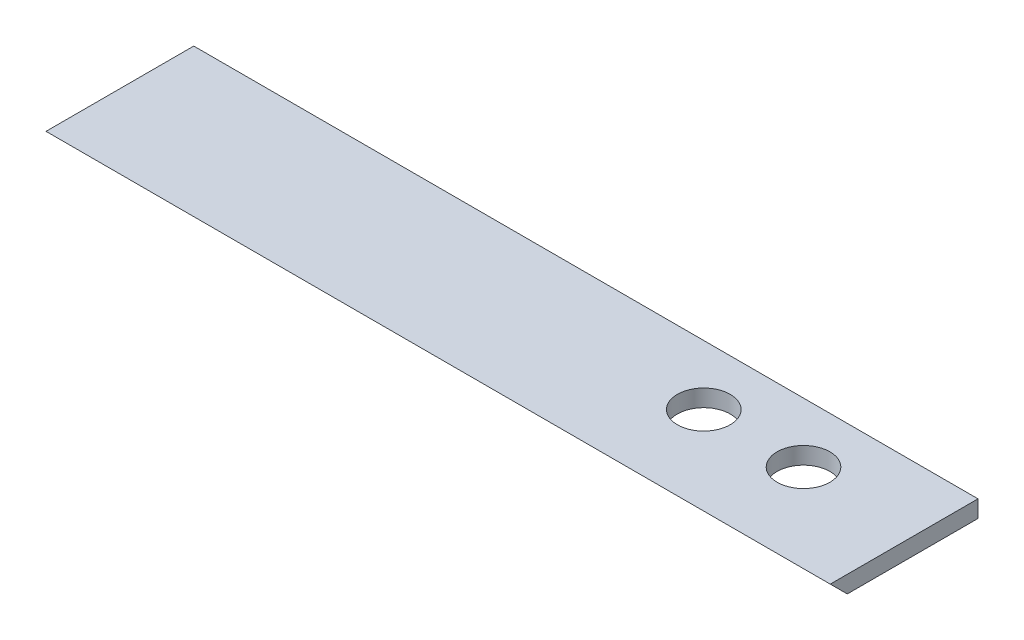
ISO-10303-21;
HEADER;
FILE_DESCRIPTION(('STEP AP214'),'2;1');
FILE_NAME('part.step','',(''),(''),'','','');
FILE_SCHEMA(('AUTOMOTIVE_DESIGN { 1 0 10303 214 1 1 1 1 }'));
ENDSEC;
DATA;
#1=APPLICATION_CONTEXT('core data for automotive mechanical design processes');
#2=APPLICATION_PROTOCOL_DEFINITION('international standard','automotive_design',2000,#1);
#3=PRODUCT_CONTEXT('',#1,'mechanical');
#4=PRODUCT('Part','Part','',(#3));
#5=PRODUCT_RELATED_PRODUCT_CATEGORY('part','',(#4));
#6=PRODUCT_DEFINITION_FORMATION('','',#4);
#7=PRODUCT_DEFINITION_CONTEXT('part definition',#1,'design');
#8=PRODUCT_DEFINITION('design','',#6,#7);
#9=PRODUCT_DEFINITION_SHAPE('','',#8);
#10=(LENGTH_UNIT() NAMED_UNIT(*) SI_UNIT(.MILLI.,.METRE.));
#11=(NAMED_UNIT(*) PLANE_ANGLE_UNIT() SI_UNIT($,.RADIAN.));
#12=(NAMED_UNIT(*) SI_UNIT($,.STERADIAN.) SOLID_ANGLE_UNIT());
#13=UNCERTAINTY_MEASURE_WITH_UNIT(LENGTH_MEASURE(1.E-05),#10,'distance_accuracy_value','');
#14=(GEOMETRIC_REPRESENTATION_CONTEXT(3) GLOBAL_UNCERTAINTY_ASSIGNED_CONTEXT((#13)) GLOBAL_UNIT_ASSIGNED_CONTEXT((#10,
#11,#12)) REPRESENTATION_CONTEXT('',''));
#15=CARTESIAN_POINT('',(0.,0.,0.));
#16=DIRECTION('',(0.,0.,1.));
#17=DIRECTION('',(1.,0.,0.));
#18=AXIS2_PLACEMENT_3D('',#15,#16,#17);
#19=CARTESIAN_POINT('',(813.499456959929,19.05,-149.281818106448));
#20=DIRECTION('',(1.,0.,0.));
#21=DIRECTION('',(0.,0.,-1.));
#22=AXIS2_PLACEMENT_3D('',#19,#20,#21);
#23=PLANE('',#22);
#24=DIRECTION('',(0.,0.707106781186551,0.707106781186544));
#25=VECTOR('',#24,1.);
#26=CARTESIAN_POINT('',(813.499456959929,-63.5,-66.7318181064474));
#27=LINE('',#26,#25);
#28=CARTESIAN_POINT('',(813.499456959929,0.,-3.23181810644817));
#29=VERTEX_POINT('',#28);
#30=CARTESIAN_POINT('',(813.499456959929,19.05,15.8181818935516));
#31=VERTEX_POINT('',#30);
#32=EDGE_CURVE('E107',#29,#31,#27,.T.);
#33=ORIENTED_EDGE('',*,*,#32,.F.);
#34=DIRECTION('',(0.,0.,1.));
#35=VECTOR('',#34,1.);
#36=CARTESIAN_POINT('',(813.499456959929,0.,-149.281818106448));
#37=LINE('',#36,#35);
#38=CARTESIAN_POINT('',(813.499456959929,0.,-149.281818106448));
#39=VERTEX_POINT('',#38);
#40=EDGE_CURVE('E85',#39,#29,#37,.T.);
#41=ORIENTED_EDGE('',*,*,#40,.F.);
#42=DIRECTION('',(0.,-1.,0.));
#43=VECTOR('',#42,1.);
#44=CARTESIAN_POINT('',(813.499456959929,19.05,-149.281818106448));
#45=LINE('',#44,#43);
#46=CARTESIAN_POINT('',(813.499456959929,19.05,-149.281818106448));
#47=VERTEX_POINT('',#46);
#48=EDGE_CURVE('E41',#47,#39,#45,.T.);
#49=ORIENTED_EDGE('',*,*,#48,.F.);
#50=DIRECTION('',(0.,0.,1.));
#51=VECTOR('',#50,1.);
#52=CARTESIAN_POINT('',(813.499456959929,19.05,-149.281818106448));
#53=LINE('',#52,#51);
#54=EDGE_CURVE('E93',#47,#31,#53,.T.);
#55=ORIENTED_EDGE('',*,*,#54,.T.);
#56=EDGE_LOOP('',(#33,#41,#49,#55));
#57=FACE_BOUND('',#56,.T.);
#58=ADVANCED_FACE('F34',(#57),#23,.T.);
#59=CARTESIAN_POINT('',(-62.800543040071,19.05,-149.281818106448));
#60=DIRECTION('',(0.,0.,-1.));
#61=DIRECTION('',(-1.,0.,0.));
#62=AXIS2_PLACEMENT_3D('',#59,#60,#61);
#63=PLANE('',#62);
#64=DIRECTION('',(1.,0.,0.));
#65=VECTOR('',#64,1.);
#66=CARTESIAN_POINT('',(-62.800543040071,0.,-149.281818106448));
#67=LINE('',#66,#65);
#68=CARTESIAN_POINT('',(-62.800543040071,0.,-149.281818106448));
#69=VERTEX_POINT('',#68);
#70=EDGE_CURVE('E80',#69,#39,#67,.T.);
#71=ORIENTED_EDGE('',*,*,#70,.F.);
#72=DIRECTION('',(0.,-1.,0.));
#73=VECTOR('',#72,1.);
#74=CARTESIAN_POINT('',(-62.800543040071,19.05,-149.281818106448));
#75=LINE('',#74,#73);
#76=CARTESIAN_POINT('',(-62.800543040071,19.05,-149.281818106448));
#77=VERTEX_POINT('',#76);
#78=EDGE_CURVE('E56',#77,#69,#75,.T.);
#79=ORIENTED_EDGE('',*,*,#78,.F.);
#80=DIRECTION('',(1.,0.,0.));
#81=VECTOR('',#80,1.);
#82=CARTESIAN_POINT('',(-62.800543040071,19.05,-149.281818106448));
#83=LINE('',#82,#81);
#84=EDGE_CURVE('E91',#77,#47,#83,.T.);
#85=ORIENTED_EDGE('',*,*,#84,.T.);
#86=ORIENTED_EDGE('',*,*,#48,.T.);
#87=EDGE_LOOP('',(#71,#79,#85,#86));
#88=FACE_BOUND('',#87,.T.);
#89=ADVANCED_FACE('F83',(#88),#63,.T.);
#90=CARTESIAN_POINT('',(-62.800543040071,19.05,-149.281818106448));
#91=DIRECTION('',(1.,0.,0.));
#92=DIRECTION('',(0.,0.,-1.));
#93=AXIS2_PLACEMENT_3D('',#90,#91,#92);
#94=PLANE('',#93);
#95=DIRECTION('',(0.,0.,1.));
#96=VECTOR('',#95,1.);
#97=CARTESIAN_POINT('',(-62.800543040071,0.,-149.281818106448));
#98=LINE('',#97,#96);
#99=CARTESIAN_POINT('',(-62.800543040071,0.,-3.2318181064481));
#100=VERTEX_POINT('',#99);
#101=EDGE_CURVE('E70',#69,#100,#98,.T.);
#102=ORIENTED_EDGE('',*,*,#101,.T.);
#103=DIRECTION('',(0.,-0.707106781186551,-0.707106781186544));
#104=VECTOR('',#103,1.);
#105=CARTESIAN_POINT('',(-62.800543040071,0.,-3.23181810644809));
#106=LINE('',#105,#104);
#107=CARTESIAN_POINT('',(-62.800543040071,19.05,15.8181818935517));
#108=VERTEX_POINT('',#107);
#109=EDGE_CURVE('E47',#108,#100,#106,.T.);
#110=ORIENTED_EDGE('',*,*,#109,.F.);
#111=DIRECTION('',(0.,0.,1.));
#112=VECTOR('',#111,1.);
#113=CARTESIAN_POINT('',(-62.800543040071,19.05,-149.281818106448));
#114=LINE('',#113,#112);
#115=EDGE_CURVE('E72',#77,#108,#114,.T.);
#116=ORIENTED_EDGE('',*,*,#115,.F.);
#117=ORIENTED_EDGE('',*,*,#78,.T.);
#118=EDGE_LOOP('',(#102,#110,#116,#117));
#119=FACE_BOUND('',#118,.T.);
#120=ADVANCED_FACE('F69',(#119),#94,.F.);
#121=CARTESIAN_POINT('',(0.,19.05,0.));
#122=DIRECTION('',(0.,-1.,0.));
#123=DIRECTION('',(0.,0.,-1.));
#124=AXIS2_PLACEMENT_3D('',#121,#122,#123);
#125=PLANE('',#124);
#126=CARTESIAN_POINT('',(685.24027425031,19.05,-82.5679467617447));
#127=DIRECTION('',(0.,1.,0.));
#128=DIRECTION('',(0.,0.,1.));
#129=AXIS2_PLACEMENT_3D('',#126,#127,#128);
#130=CIRCLE('',#129,29.499999928);
#131=CARTESIAN_POINT('',(685.24027425031,19.05,-53.0679468337446));
#132=VERTEX_POINT('',#131);
#133=EDGE_CURVE('E104',#132,#132,#130,.T.);
#134=ORIENTED_EDGE('',*,*,#133,.F.);
#135=EDGE_LOOP('',(#134));
#136=FACE_BOUND('',#135,.T.);
#137=CARTESIAN_POINT('',(573.905935057533,19.05,-82.4588113000032));
#138=DIRECTION('',(0.,1.,0.));
#139=DIRECTION('',(0.,0.,1.));
#140=AXIS2_PLACEMENT_3D('',#137,#138,#139);
#141=CIRCLE('',#140,29.4999999279999);
#142=CARTESIAN_POINT('',(573.905935057533,19.05,-52.9588113720032));
#143=VERTEX_POINT('',#142);
#144=EDGE_CURVE('E98',#143,#143,#141,.T.);
#145=ORIENTED_EDGE('',*,*,#144,.F.);
#146=EDGE_LOOP('',(#145));
#147=FACE_BOUND('',#146,.T.);
#148=DIRECTION('',(1.,0.,0.));
#149=VECTOR('',#148,1.);
#150=CARTESIAN_POINT('',(-62.800543040071,19.05,15.8181818935517));
#151=LINE('',#150,#149);
#152=EDGE_CURVE('E81',#108,#31,#151,.T.);
#153=ORIENTED_EDGE('',*,*,#152,.T.);
#154=ORIENTED_EDGE('',*,*,#54,.F.);
#155=ORIENTED_EDGE('',*,*,#84,.F.);
#156=ORIENTED_EDGE('',*,*,#115,.T.);
#157=EDGE_LOOP('',(#153,#154,#155,#156));
#158=FACE_BOUND('',#157,.T.);
#159=ADVANCED_FACE('F120',(#136,#147,#158),#125,.F.);
#160=CARTESIAN_POINT('',(0.,0.,0.));
#161=DIRECTION('',(0.,-1.,0.));
#162=DIRECTION('',(0.,0.,-1.));
#163=AXIS2_PLACEMENT_3D('',#160,#161,#162);
#164=PLANE('',#163);
#165=DIRECTION('',(1.,0.,0.));
#166=VECTOR('',#165,1.);
#167=CARTESIAN_POINT('',(0.,0.,-3.2318181064481));
#168=LINE('',#167,#166);
#169=EDGE_CURVE('E11',#100,#29,#168,.T.);
#170=ORIENTED_EDGE('',*,*,#169,.F.);
#171=ORIENTED_EDGE('',*,*,#101,.F.);
#172=ORIENTED_EDGE('',*,*,#70,.T.);
#173=ORIENTED_EDGE('',*,*,#40,.T.);
#174=EDGE_LOOP('',(#170,#171,#172,#173));
#175=FACE_BOUND('',#174,.T.);
#176=CARTESIAN_POINT('',(685.24027425031,0.,-82.5679467617447));
#177=DIRECTION('',(0.,1.,0.));
#178=DIRECTION('',(0.,0.,1.));
#179=AXIS2_PLACEMENT_3D('',#176,#177,#178);
#180=CIRCLE('',#179,29.499999928);
#181=CARTESIAN_POINT('',(685.24027425031,0.,-53.0679468337446));
#182=VERTEX_POINT('',#181);
#183=EDGE_CURVE('E101',#182,#182,#180,.T.);
#184=ORIENTED_EDGE('',*,*,#183,.T.);
#185=EDGE_LOOP('',(#184));
#186=FACE_BOUND('',#185,.T.);
#187=CARTESIAN_POINT('',(573.905935057533,0.,-82.4588113000032));
#188=DIRECTION('',(0.,1.,0.));
#189=DIRECTION('',(0.,0.,1.));
#190=AXIS2_PLACEMENT_3D('',#187,#188,#189);
#191=CIRCLE('',#190,29.4999999279999);
#192=CARTESIAN_POINT('',(573.905935057533,0.,-52.9588113720032));
#193=VERTEX_POINT('',#192);
#194=EDGE_CURVE('E87',#193,#193,#191,.T.);
#195=ORIENTED_EDGE('',*,*,#194,.T.);
#196=EDGE_LOOP('',(#195));
#197=FACE_BOUND('',#196,.T.);
#198=ADVANCED_FACE('F77',(#175,#186,#197),#164,.T.);
#199=CARTESIAN_POINT('',(573.905935057533,0.,-82.4588113000032));
#200=DIRECTION('',(0.,1.,0.));
#201=DIRECTION('',(0.,0.,1.));
#202=AXIS2_PLACEMENT_3D('',#199,#200,#201);
#203=CYLINDRICAL_SURFACE('',#202,29.4999999279999);
#204=CARTESIAN_POINT('',(573.905935057533,0.,-52.9588113720032));
#205=CARTESIAN_POINT('',(573.905935057533,0.1984375,-52.9588113720032));
#206=CARTESIAN_POINT('',(573.905935057533,0.396875,-52.9588113720032));
#207=CARTESIAN_POINT('',(573.905935057533,0.79375,-52.9588113720032));
#208=CARTESIAN_POINT('',(573.905935057533,0.9921875,-52.9588113720032));
#209=CARTESIAN_POINT('',(573.905935057533,1.3890625,-52.9588113720032));
#210=CARTESIAN_POINT('',(573.905935057533,1.5875,-52.9588113720032));
#211=CARTESIAN_POINT('',(573.905935057533,1.984375,-52.9588113720032));
#212=CARTESIAN_POINT('',(573.905935057533,2.1828125,-52.9588113720032));
#213=CARTESIAN_POINT('',(573.905935057533,2.5796875,-52.9588113720032));
#214=CARTESIAN_POINT('',(573.905935057533,2.778125,-52.9588113720032));
#215=CARTESIAN_POINT('',(573.905935057533,3.175,-52.9588113720032));
#216=CARTESIAN_POINT('',(573.905935057533,3.3734375,-52.9588113720032));
#217=CARTESIAN_POINT('',(573.905935057533,3.7703125,-52.9588113720032));
#218=CARTESIAN_POINT('',(573.905935057533,3.96875,-52.9588113720032));
#219=CARTESIAN_POINT('',(573.905935057533,4.365625,-52.9588113720032));
#220=CARTESIAN_POINT('',(573.905935057533,4.5640625,-52.9588113720032));
#221=CARTESIAN_POINT('',(573.905935057533,4.9609375,-52.9588113720032));
#222=CARTESIAN_POINT('',(573.905935057533,5.159375,-52.9588113720032));
#223=CARTESIAN_POINT('',(573.905935057533,5.55625,-52.9588113720032));
#224=CARTESIAN_POINT('',(573.905935057533,5.7546875,-52.9588113720032));
#225=CARTESIAN_POINT('',(573.905935057533,6.1515625,-52.9588113720032));
#226=CARTESIAN_POINT('',(573.905935057533,6.35,-52.9588113720032));
#227=CARTESIAN_POINT('',(573.905935057533,6.746875,-52.9588113720032));
#228=CARTESIAN_POINT('',(573.905935057533,6.9453125,-52.9588113720032));
#229=CARTESIAN_POINT('',(573.905935057533,7.3421875,-52.9588113720032));
#230=CARTESIAN_POINT('',(573.905935057533,7.540625,-52.9588113720032));
#231=CARTESIAN_POINT('',(573.905935057533,7.9375,-52.9588113720032));
#232=CARTESIAN_POINT('',(573.905935057533,8.1359375,-52.9588113720032));
#233=CARTESIAN_POINT('',(573.905935057533,8.5328125,-52.9588113720032));
#234=CARTESIAN_POINT('',(573.905935057533,8.73125,-52.9588113720032));
#235=CARTESIAN_POINT('',(573.905935057533,9.128125,-52.9588113720032));
#236=CARTESIAN_POINT('',(573.905935057533,9.3265625,-52.9588113720032));
#237=CARTESIAN_POINT('',(573.905935057533,9.7234375,-52.9588113720032));
#238=CARTESIAN_POINT('',(573.905935057533,9.921875,-52.9588113720032));
#239=CARTESIAN_POINT('',(573.905935057533,10.31875,-52.9588113720032));
#240=CARTESIAN_POINT('',(573.905935057533,10.5171875,-52.9588113720032));
#241=CARTESIAN_POINT('',(573.905935057533,10.9140625,-52.9588113720032));
#242=CARTESIAN_POINT('',(573.905935057533,11.1125,-52.9588113720032));
#243=CARTESIAN_POINT('',(573.905935057533,11.509375,-52.9588113720032));
#244=CARTESIAN_POINT('',(573.905935057533,11.7078125,-52.9588113720032));
#245=CARTESIAN_POINT('',(573.905935057533,12.1046875,-52.9588113720032));
#246=CARTESIAN_POINT('',(573.905935057533,12.303125,-52.9588113720032));
#247=CARTESIAN_POINT('',(573.905935057533,12.7,-52.9588113720032));
#248=CARTESIAN_POINT('',(573.905935057533,12.8984375,-52.9588113720032));
#249=CARTESIAN_POINT('',(573.905935057533,13.2953125,-52.9588113720032));
#250=CARTESIAN_POINT('',(573.905935057533,13.49375,-52.9588113720032));
#251=CARTESIAN_POINT('',(573.905935057533,13.890625,-52.9588113720032));
#252=CARTESIAN_POINT('',(573.905935057533,14.0890625,-52.9588113720032));
#253=CARTESIAN_POINT('',(573.905935057533,14.4859375,-52.9588113720032));
#254=CARTESIAN_POINT('',(573.905935057533,14.684375,-52.9588113720032));
#255=CARTESIAN_POINT('',(573.905935057533,15.08125,-52.9588113720032));
#256=CARTESIAN_POINT('',(573.905935057533,15.2796875,-52.9588113720032));
#257=CARTESIAN_POINT('',(573.905935057533,15.6765625,-52.9588113720032));
#258=CARTESIAN_POINT('',(573.905935057533,15.875,-52.9588113720032));
#259=CARTESIAN_POINT('',(573.905935057533,16.271875,-52.9588113720032));
#260=CARTESIAN_POINT('',(573.905935057533,16.4703125,-52.9588113720032));
#261=CARTESIAN_POINT('',(573.905935057533,16.8671875,-52.9588113720032));
#262=CARTESIAN_POINT('',(573.905935057533,17.065625,-52.9588113720032));
#263=CARTESIAN_POINT('',(573.905935057533,17.4625,-52.9588113720032));
#264=CARTESIAN_POINT('',(573.905935057533,17.6609375,-52.9588113720032));
#265=CARTESIAN_POINT('',(573.905935057533,18.0578125,-52.9588113720032));
#266=CARTESIAN_POINT('',(573.905935057533,18.25625,-52.9588113720032));
#267=CARTESIAN_POINT('',(573.905935057533,18.653125,-52.9588113720032));
#268=CARTESIAN_POINT('',(573.905935057533,18.8515625,-52.9588113720032));
#269=CARTESIAN_POINT('',(573.905935057533,19.05,-52.9588113720032));
#270=B_SPLINE_CURVE_WITH_KNOTS('',3,(#204,#205,#206,#207,#208,#209,#210,#211,#212,#213,#214,
#215,#216,#217,#218,#219,#220,#221,#222,#223,#224,#225,#226,#227,#228,#229,#230,#231,#232,#233,
#234,#235,#236,#237,#238,#239,#240,#241,#242,#243,#244,#245,#246,#247,#248,#249,#250,#251,#252,
#253,#254,#255,#256,#257,#258,#259,#260,#261,#262,#263,#264,#265,#266,#267,#268,#269),
.UNSPECIFIED.,.F.,.F.,(4,2,2,2,2,2,2,2,2,2,2,2,2,2,2,2,2,2,2,2,2,2,2,2,2,2,2,2,2,2,2,2,4),(0.,
0.5953125,1.190625,1.7859375,2.38125,2.9765625,3.571875,4.1671875,4.7625,5.3578125,5.953125,
6.5484375,7.14375,7.7390625,8.334375,8.9296875,9.525,10.1203125,10.715625,11.3109375,11.90625,
12.5015625,13.096875,13.6921875,14.2875,14.8828125,15.478125,16.0734375,16.66875,17.2640625,
17.859375,18.4546875,19.05),.UNSPECIFIED.);
#271=EDGE_CURVE('BSEAM133',#193,#143,#270,.T.);
#272=ORIENTED_EDGE('',*,*,#194,.F.);
#273=ORIENTED_EDGE('',*,*,#144,.T.);
#274=ORIENTED_EDGE('',*,*,#271,.T.);
#275=ORIENTED_EDGE('',*,*,#271,.F.);
#276=EDGE_LOOP('',(#272,#274,#273,#275));
#277=FACE_BOUND('',#276,.T.);
#278=ADVANCED_FACE('F133',(#277),#203,.F.);
#279=CARTESIAN_POINT('',(685.24027425031,0.,-82.5679467617447));
#280=DIRECTION('',(0.,1.,0.));
#281=DIRECTION('',(0.,0.,1.));
#282=AXIS2_PLACEMENT_3D('',#279,#280,#281);
#283=CYLINDRICAL_SURFACE('',#282,29.499999928);
#284=CARTESIAN_POINT('',(685.24027425031,0.,-53.0679468337446));
#285=CARTESIAN_POINT('',(685.24027425031,0.1984375,-53.0679468337446));
#286=CARTESIAN_POINT('',(685.24027425031,0.396875,-53.0679468337446));
#287=CARTESIAN_POINT('',(685.24027425031,0.79375,-53.0679468337446));
#288=CARTESIAN_POINT('',(685.24027425031,0.9921875,-53.0679468337446));
#289=CARTESIAN_POINT('',(685.24027425031,1.3890625,-53.0679468337446));
#290=CARTESIAN_POINT('',(685.24027425031,1.5875,-53.0679468337446));
#291=CARTESIAN_POINT('',(685.24027425031,1.984375,-53.0679468337446));
#292=CARTESIAN_POINT('',(685.24027425031,2.1828125,-53.0679468337446));
#293=CARTESIAN_POINT('',(685.24027425031,2.5796875,-53.0679468337446));
#294=CARTESIAN_POINT('',(685.24027425031,2.778125,-53.0679468337446));
#295=CARTESIAN_POINT('',(685.24027425031,3.175,-53.0679468337446));
#296=CARTESIAN_POINT('',(685.24027425031,3.3734375,-53.0679468337446));
#297=CARTESIAN_POINT('',(685.24027425031,3.7703125,-53.0679468337446));
#298=CARTESIAN_POINT('',(685.24027425031,3.96875,-53.0679468337446));
#299=CARTESIAN_POINT('',(685.24027425031,4.365625,-53.0679468337446));
#300=CARTESIAN_POINT('',(685.24027425031,4.5640625,-53.0679468337446));
#301=CARTESIAN_POINT('',(685.24027425031,4.9609375,-53.0679468337446));
#302=CARTESIAN_POINT('',(685.24027425031,5.159375,-53.0679468337446));
#303=CARTESIAN_POINT('',(685.24027425031,5.55625,-53.0679468337446));
#304=CARTESIAN_POINT('',(685.24027425031,5.7546875,-53.0679468337446));
#305=CARTESIAN_POINT('',(685.24027425031,6.1515625,-53.0679468337446));
#306=CARTESIAN_POINT('',(685.24027425031,6.35,-53.0679468337446));
#307=CARTESIAN_POINT('',(685.24027425031,6.746875,-53.0679468337446));
#308=CARTESIAN_POINT('',(685.24027425031,6.9453125,-53.0679468337446));
#309=CARTESIAN_POINT('',(685.24027425031,7.3421875,-53.0679468337446));
#310=CARTESIAN_POINT('',(685.24027425031,7.540625,-53.0679468337446));
#311=CARTESIAN_POINT('',(685.24027425031,7.9375,-53.0679468337446));
#312=CARTESIAN_POINT('',(685.24027425031,8.1359375,-53.0679468337446));
#313=CARTESIAN_POINT('',(685.24027425031,8.5328125,-53.0679468337446));
#314=CARTESIAN_POINT('',(685.24027425031,8.73125,-53.0679468337446));
#315=CARTESIAN_POINT('',(685.24027425031,9.128125,-53.0679468337446));
#316=CARTESIAN_POINT('',(685.24027425031,9.3265625,-53.0679468337446));
#317=CARTESIAN_POINT('',(685.24027425031,9.7234375,-53.0679468337446));
#318=CARTESIAN_POINT('',(685.24027425031,9.921875,-53.0679468337446));
#319=CARTESIAN_POINT('',(685.24027425031,10.31875,-53.0679468337446));
#320=CARTESIAN_POINT('',(685.24027425031,10.5171875,-53.0679468337446));
#321=CARTESIAN_POINT('',(685.24027425031,10.9140625,-53.0679468337446));
#322=CARTESIAN_POINT('',(685.24027425031,11.1125,-53.0679468337446));
#323=CARTESIAN_POINT('',(685.24027425031,11.509375,-53.0679468337446));
#324=CARTESIAN_POINT('',(685.24027425031,11.7078125,-53.0679468337446));
#325=CARTESIAN_POINT('',(685.24027425031,12.1046875,-53.0679468337446));
#326=CARTESIAN_POINT('',(685.24027425031,12.303125,-53.0679468337446));
#327=CARTESIAN_POINT('',(685.24027425031,12.7,-53.0679468337446));
#328=CARTESIAN_POINT('',(685.24027425031,12.8984375,-53.0679468337446));
#329=CARTESIAN_POINT('',(685.24027425031,13.2953125,-53.0679468337446));
#330=CARTESIAN_POINT('',(685.24027425031,13.49375,-53.0679468337446));
#331=CARTESIAN_POINT('',(685.24027425031,13.890625,-53.0679468337446));
#332=CARTESIAN_POINT('',(685.24027425031,14.0890625,-53.0679468337446));
#333=CARTESIAN_POINT('',(685.24027425031,14.4859375,-53.0679468337446));
#334=CARTESIAN_POINT('',(685.24027425031,14.684375,-53.0679468337446));
#335=CARTESIAN_POINT('',(685.24027425031,15.08125,-53.0679468337446));
#336=CARTESIAN_POINT('',(685.24027425031,15.2796875,-53.0679468337446));
#337=CARTESIAN_POINT('',(685.24027425031,15.6765625,-53.0679468337446));
#338=CARTESIAN_POINT('',(685.24027425031,15.875,-53.0679468337446));
#339=CARTESIAN_POINT('',(685.24027425031,16.271875,-53.0679468337446));
#340=CARTESIAN_POINT('',(685.24027425031,16.4703125,-53.0679468337446));
#341=CARTESIAN_POINT('',(685.24027425031,16.8671875,-53.0679468337446));
#342=CARTESIAN_POINT('',(685.24027425031,17.065625,-53.0679468337446));
#343=CARTESIAN_POINT('',(685.24027425031,17.4625,-53.0679468337446));
#344=CARTESIAN_POINT('',(685.24027425031,17.6609375,-53.0679468337446));
#345=CARTESIAN_POINT('',(685.24027425031,18.0578125,-53.0679468337446));
#346=CARTESIAN_POINT('',(685.24027425031,18.25625,-53.0679468337446));
#347=CARTESIAN_POINT('',(685.24027425031,18.653125,-53.0679468337446));
#348=CARTESIAN_POINT('',(685.24027425031,18.8515625,-53.0679468337446));
#349=CARTESIAN_POINT('',(685.24027425031,19.05,-53.0679468337446));
#350=B_SPLINE_CURVE_WITH_KNOTS('',3,(#284,#285,#286,#287,#288,#289,#290,#291,#292,#293,#294,
#295,#296,#297,#298,#299,#300,#301,#302,#303,#304,#305,#306,#307,#308,#309,#310,#311,#312,#313,
#314,#315,#316,#317,#318,#319,#320,#321,#322,#323,#324,#325,#326,#327,#328,#329,#330,#331,#332,
#333,#334,#335,#336,#337,#338,#339,#340,#341,#342,#343,#344,#345,#346,#347,#348,#349),
.UNSPECIFIED.,.F.,.F.,(4,2,2,2,2,2,2,2,2,2,2,2,2,2,2,2,2,2,2,2,2,2,2,2,2,2,2,2,2,2,2,2,4),(0.,
0.5953125,1.190625,1.7859375,2.38125,2.9765625,3.571875,4.1671875,4.7625,5.3578125,5.953125,
6.5484375,7.14375,7.7390625,8.334375,8.9296875,9.525,10.1203125,10.715625,11.3109375,11.90625,
12.5015625,13.096875,13.6921875,14.2875,14.8828125,15.478125,16.0734375,16.66875,17.2640625,
17.859375,18.4546875,19.05),.UNSPECIFIED.);
#351=EDGE_CURVE('BSEAM139',#182,#132,#350,.T.);
#352=ORIENTED_EDGE('',*,*,#183,.F.);
#353=ORIENTED_EDGE('',*,*,#133,.T.);
#354=ORIENTED_EDGE('',*,*,#351,.T.);
#355=ORIENTED_EDGE('',*,*,#351,.F.);
#356=EDGE_LOOP('',(#352,#354,#353,#355));
#357=FACE_BOUND('',#356,.T.);
#358=ADVANCED_FACE('F139',(#357),#283,.F.);
#359=CARTESIAN_POINT('',(851.599456959929,0.,-3.23181810644817));
#360=DIRECTION('',(0.,0.707106781186544,-0.707106781186551));
#361=DIRECTION('',(0.,0.707106781186551,0.707106781186544));
#362=AXIS2_PLACEMENT_3D('',#359,#360,#361);
#363=PLANE('',#362);
#364=ORIENTED_EDGE('',*,*,#32,.T.);
#365=ORIENTED_EDGE('',*,*,#152,.F.);
#366=ORIENTED_EDGE('',*,*,#109,.T.);
#367=ORIENTED_EDGE('',*,*,#169,.T.);
#368=EDGE_LOOP('',(#364,#365,#366,#367));
#369=FACE_BOUND('',#368,.T.);
#370=ADVANCED_FACE('F114',(#369),#363,.F.);
#371=CLOSED_SHELL('',(#58,#89,#120,#159,#198,#278,#358,#370));
#372=MANIFOLD_SOLID_BREP('B2',#371);
#373=ADVANCED_BREP_SHAPE_REPRESENTATION('',(#18,#372),#14);
#374=SHAPE_DEFINITION_REPRESENTATION(#9,#373);
ENDSEC;
END-ISO-10303-21;
